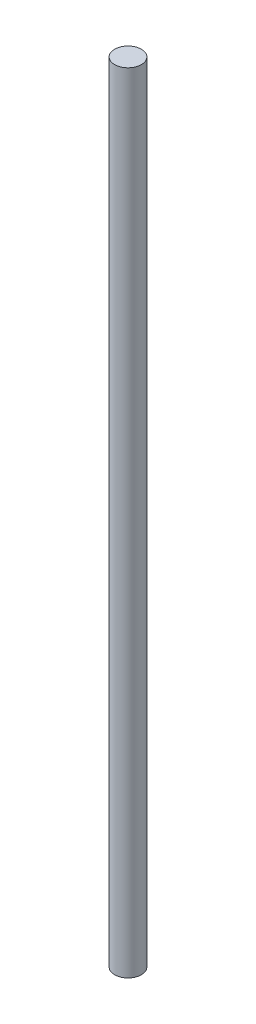
ISO-10303-21;
HEADER;
FILE_DESCRIPTION(('STEP AP214'),'2;1');
FILE_NAME('part.step','',(''),(''),'','','');
FILE_SCHEMA(('AUTOMOTIVE_DESIGN { 1 0 10303 214 1 1 1 1 }'));
ENDSEC;
DATA;
#1=APPLICATION_CONTEXT('core data for automotive mechanical design processes');
#2=APPLICATION_PROTOCOL_DEFINITION('international standard','automotive_design',2000,#1);
#3=PRODUCT_CONTEXT('',#1,'mechanical');
#4=PRODUCT('Part','Part','',(#3));
#5=PRODUCT_RELATED_PRODUCT_CATEGORY('part','',(#4));
#6=PRODUCT_DEFINITION_FORMATION('','',#4);
#7=PRODUCT_DEFINITION_CONTEXT('part definition',#1,'design');
#8=PRODUCT_DEFINITION('design','',#6,#7);
#9=PRODUCT_DEFINITION_SHAPE('','',#8);
#10=(LENGTH_UNIT() NAMED_UNIT(*) SI_UNIT(.MILLI.,.METRE.));
#11=(NAMED_UNIT(*) PLANE_ANGLE_UNIT() SI_UNIT($,.RADIAN.));
#12=(NAMED_UNIT(*) SI_UNIT($,.STERADIAN.) SOLID_ANGLE_UNIT());
#13=UNCERTAINTY_MEASURE_WITH_UNIT(LENGTH_MEASURE(1.E-05),#10,'distance_accuracy_value','');
#14=(GEOMETRIC_REPRESENTATION_CONTEXT(3) GLOBAL_UNCERTAINTY_ASSIGNED_CONTEXT((#13)) GLOBAL_UNIT_ASSIGNED_CONTEXT((#10,
#11,#12)) REPRESENTATION_CONTEXT('',''));
#15=CARTESIAN_POINT('',(0.,0.,0.));
#16=DIRECTION('',(0.,0.,1.));
#17=DIRECTION('',(1.,0.,0.));
#18=AXIS2_PLACEMENT_3D('',#15,#16,#17);
#19=CARTESIAN_POINT('',(0.,1500.,0.));
#20=DIRECTION('',(0.,-1.,0.));
#21=DIRECTION('',(0.,0.,-1.));
#22=AXIS2_PLACEMENT_3D('',#19,#20,#21);
#23=CYLINDRICAL_SURFACE('',#22,25.4);
#24=CARTESIAN_POINT('',(0.,1500.,0.));
#25=DIRECTION('',(0.,1.,0.));
#26=DIRECTION('',(0.,0.,1.));
#27=AXIS2_PLACEMENT_3D('',#24,#25,#26);
#28=CIRCLE('',#27,25.4);
#29=CARTESIAN_POINT('',(0.,1500.,25.4));
#30=VERTEX_POINT('',#29);
#31=EDGE_CURVE('E10',#30,#30,#28,.T.);
#32=ORIENTED_EDGE('',*,*,#31,.F.);
#33=EDGE_LOOP('',(#32));
#34=FACE_BOUND('',#33,.T.);
#35=CARTESIAN_POINT('',(0.,0.,0.));
#36=DIRECTION('',(0.,1.,0.));
#37=DIRECTION('',(0.,0.,1.));
#38=AXIS2_PLACEMENT_3D('',#35,#36,#37);
#39=CIRCLE('',#38,25.4);
#40=CARTESIAN_POINT('',(0.,0.,25.4));
#41=VERTEX_POINT('',#40);
#42=EDGE_CURVE('E34',#41,#41,#39,.T.);
#43=ORIENTED_EDGE('',*,*,#42,.T.);
#44=EDGE_LOOP('',(#43));
#45=FACE_BOUND('',#44,.T.);
#46=ADVANCED_FACE('F31',(#34,#45),#23,.T.);
#47=CARTESIAN_POINT('',(0.,1500.,0.));
#48=DIRECTION('',(0.,1.,0.));
#49=DIRECTION('',(0.,0.,1.));
#50=AXIS2_PLACEMENT_3D('',#47,#48,#49);
#51=PLANE('',#50);
#52=ORIENTED_EDGE('',*,*,#31,.T.);
#53=EDGE_LOOP('',(#52));
#54=FACE_BOUND('',#53,.T.);
#55=ADVANCED_FACE('F46',(#54),#51,.T.);
#56=CARTESIAN_POINT('',(0.,0.,0.));
#57=DIRECTION('',(0.,1.,0.));
#58=DIRECTION('',(0.,0.,1.));
#59=AXIS2_PLACEMENT_3D('',#56,#57,#58);
#60=PLANE('',#59);
#61=ORIENTED_EDGE('',*,*,#42,.F.);
#62=EDGE_LOOP('',(#61));
#63=FACE_BOUND('',#62,.T.);
#64=ADVANCED_FACE('F44',(#63),#60,.F.);
#65=CLOSED_SHELL('',(#46,#55,#64));
#66=MANIFOLD_SOLID_BREP('B2',#65);
#67=ADVANCED_BREP_SHAPE_REPRESENTATION('',(#18,#66),#14);
#68=SHAPE_DEFINITION_REPRESENTATION(#9,#67);
ENDSEC;
END-ISO-10303-21;
